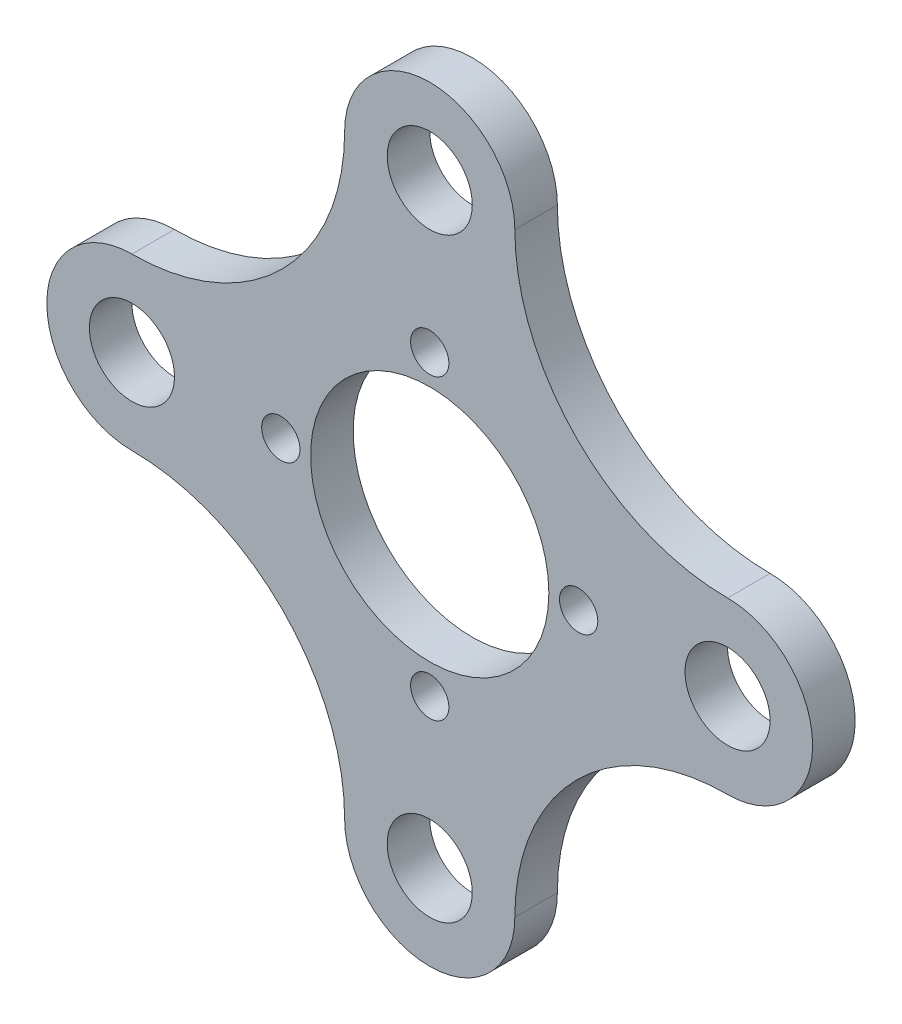
ISO-10303-21;
HEADER;
FILE_DESCRIPTION(('STEP AP214'),'2;1');
FILE_NAME('part.step','',(''),(''),'','','');
FILE_SCHEMA(('AUTOMOTIVE_DESIGN { 1 0 10303 214 1 1 1 1 }'));
ENDSEC;
DATA;
#1=APPLICATION_CONTEXT('core data for automotive mechanical design processes');
#2=APPLICATION_PROTOCOL_DEFINITION('international standard','automotive_design',2000,#1);
#3=PRODUCT_CONTEXT('',#1,'mechanical');
#4=PRODUCT('Part','Part','',(#3));
#5=PRODUCT_RELATED_PRODUCT_CATEGORY('part','',(#4));
#6=PRODUCT_DEFINITION_FORMATION('','',#4);
#7=PRODUCT_DEFINITION_CONTEXT('part definition',#1,'design');
#8=PRODUCT_DEFINITION('design','',#6,#7);
#9=PRODUCT_DEFINITION_SHAPE('','',#8);
#10=(LENGTH_UNIT() NAMED_UNIT(*) SI_UNIT(.MILLI.,.METRE.));
#11=(NAMED_UNIT(*) PLANE_ANGLE_UNIT() SI_UNIT($,.RADIAN.));
#12=(NAMED_UNIT(*) SI_UNIT($,.STERADIAN.) SOLID_ANGLE_UNIT());
#13=UNCERTAINTY_MEASURE_WITH_UNIT(LENGTH_MEASURE(1.E-05),#10,'distance_accuracy_value','');
#14=(GEOMETRIC_REPRESENTATION_CONTEXT(3) GLOBAL_UNCERTAINTY_ASSIGNED_CONTEXT((#13)) GLOBAL_UNIT_ASSIGNED_CONTEXT((#10,
#11,#12)) REPRESENTATION_CONTEXT('',''));
#15=CARTESIAN_POINT('',(0.,0.,0.));
#16=DIRECTION('',(0.,0.,1.));
#17=DIRECTION('',(1.,0.,0.));
#18=AXIS2_PLACEMENT_3D('',#15,#16,#17);
#19=CARTESIAN_POINT('',(0.,0.,5.));
#20=DIRECTION('',(0.,0.,-1.));
#21=DIRECTION('',(-1.,0.,0.));
#22=AXIS2_PLACEMENT_3D('',#19,#20,#21);
#23=CYLINDRICAL_SURFACE('',#22,14.);
#24=CARTESIAN_POINT('',(0.,0.,5.));
#25=DIRECTION('',(0.,0.,1.));
#26=DIRECTION('',(1.,0.,0.));
#27=AXIS2_PLACEMENT_3D('',#24,#25,#26);
#28=CIRCLE('',#27,14.);
#29=CARTESIAN_POINT('',(14.,0.,5.));
#30=VERTEX_POINT('',#29);
#31=EDGE_CURVE('E12',#30,#30,#28,.T.);
#32=ORIENTED_EDGE('',*,*,#31,.T.);
#33=EDGE_LOOP('',(#32));
#34=FACE_BOUND('',#33,.T.);
#35=CARTESIAN_POINT('',(0.,0.,0.));
#36=DIRECTION('',(0.,0.,1.));
#37=DIRECTION('',(1.,0.,0.));
#38=AXIS2_PLACEMENT_3D('',#35,#36,#37);
#39=CIRCLE('',#38,14.);
#40=CARTESIAN_POINT('',(14.,0.,0.));
#41=VERTEX_POINT('',#40);
#42=EDGE_CURVE('E107',#41,#41,#39,.T.);
#43=ORIENTED_EDGE('',*,*,#42,.F.);
#44=EDGE_LOOP('',(#43));
#45=FACE_BOUND('',#44,.T.);
#46=ADVANCED_FACE('F103',(#34,#45),#23,.F.);
#47=CARTESIAN_POINT('',(17.5,0.,5.));
#48=DIRECTION('',(0.,0.,-1.));
#49=DIRECTION('',(-1.,0.,0.));
#50=AXIS2_PLACEMENT_3D('',#47,#48,#49);
#51=CYLINDRICAL_SURFACE('',#50,2.25);
#52=CARTESIAN_POINT('',(17.5,0.,5.));
#53=DIRECTION('',(0.,0.,1.));
#54=DIRECTION('',(1.,0.,0.));
#55=AXIS2_PLACEMENT_3D('',#52,#53,#54);
#56=CIRCLE('',#55,2.25);
#57=CARTESIAN_POINT('',(19.75,0.,5.));
#58=VERTEX_POINT('',#57);
#59=EDGE_CURVE('E113',#58,#58,#56,.T.);
#60=ORIENTED_EDGE('',*,*,#59,.T.);
#61=EDGE_LOOP('',(#60));
#62=FACE_BOUND('',#61,.T.);
#63=CARTESIAN_POINT('',(17.5,0.,0.));
#64=DIRECTION('',(0.,0.,1.));
#65=DIRECTION('',(1.,0.,0.));
#66=AXIS2_PLACEMENT_3D('',#63,#64,#65);
#67=CIRCLE('',#66,2.25);
#68=CARTESIAN_POINT('',(19.75,0.,0.));
#69=VERTEX_POINT('',#68);
#70=EDGE_CURVE('E281',#69,#69,#67,.T.);
#71=ORIENTED_EDGE('',*,*,#70,.F.);
#72=EDGE_LOOP('',(#71));
#73=FACE_BOUND('',#72,.T.);
#74=ADVANCED_FACE('F290',(#62,#73),#51,.F.);
#75=CARTESIAN_POINT('',(0.,-17.5,5.));
#76=DIRECTION('',(0.,0.,-1.));
#77=DIRECTION('',(-1.,0.,0.));
#78=AXIS2_PLACEMENT_3D('',#75,#76,#77);
#79=CYLINDRICAL_SURFACE('',#78,2.25);
#80=CARTESIAN_POINT('',(0.,-17.5,5.));
#81=DIRECTION('',(0.,0.,1.));
#82=DIRECTION('',(1.,0.,0.));
#83=AXIS2_PLACEMENT_3D('',#80,#81,#82);
#84=CIRCLE('',#83,2.25);
#85=CARTESIAN_POINT('',(2.25,-17.5,5.));
#86=VERTEX_POINT('',#85);
#87=EDGE_CURVE('E269',#86,#86,#84,.T.);
#88=ORIENTED_EDGE('',*,*,#87,.T.);
#89=EDGE_LOOP('',(#88));
#90=FACE_BOUND('',#89,.T.);
#91=CARTESIAN_POINT('',(0.,-17.5,0.));
#92=DIRECTION('',(0.,0.,1.));
#93=DIRECTION('',(1.,0.,0.));
#94=AXIS2_PLACEMENT_3D('',#91,#92,#93);
#95=CIRCLE('',#94,2.25);
#96=CARTESIAN_POINT('',(2.25,-17.5,0.));
#97=VERTEX_POINT('',#96);
#98=EDGE_CURVE('E279',#97,#97,#95,.T.);
#99=ORIENTED_EDGE('',*,*,#98,.F.);
#100=EDGE_LOOP('',(#99));
#101=FACE_BOUND('',#100,.T.);
#102=ADVANCED_FACE('F296',(#90,#101),#79,.F.);
#103=CARTESIAN_POINT('',(-17.5,0.,5.));
#104=DIRECTION('',(0.,0.,-1.));
#105=DIRECTION('',(-1.,0.,0.));
#106=AXIS2_PLACEMENT_3D('',#103,#104,#105);
#107=CYLINDRICAL_SURFACE('',#106,2.25);
#108=CARTESIAN_POINT('',(-17.5,0.,5.));
#109=DIRECTION('',(0.,0.,1.));
#110=DIRECTION('',(1.,0.,0.));
#111=AXIS2_PLACEMENT_3D('',#108,#109,#110);
#112=CIRCLE('',#111,2.25);
#113=CARTESIAN_POINT('',(-15.25,0.,5.));
#114=VERTEX_POINT('',#113);
#115=EDGE_CURVE('E266',#114,#114,#112,.T.);
#116=ORIENTED_EDGE('',*,*,#115,.T.);
#117=EDGE_LOOP('',(#116));
#118=FACE_BOUND('',#117,.T.);
#119=CARTESIAN_POINT('',(-17.5,0.,0.));
#120=DIRECTION('',(0.,0.,1.));
#121=DIRECTION('',(1.,0.,0.));
#122=AXIS2_PLACEMENT_3D('',#119,#120,#121);
#123=CIRCLE('',#122,2.25);
#124=CARTESIAN_POINT('',(-15.25,0.,0.));
#125=VERTEX_POINT('',#124);
#126=EDGE_CURVE('E276',#125,#125,#123,.T.);
#127=ORIENTED_EDGE('',*,*,#126,.F.);
#128=EDGE_LOOP('',(#127));
#129=FACE_BOUND('',#128,.T.);
#130=ADVANCED_FACE('F303',(#118,#129),#107,.F.);
#131=CARTESIAN_POINT('',(0.,17.5,5.));
#132=DIRECTION('',(0.,0.,-1.));
#133=DIRECTION('',(-1.,0.,0.));
#134=AXIS2_PLACEMENT_3D('',#131,#132,#133);
#135=CYLINDRICAL_SURFACE('',#134,2.25);
#136=CARTESIAN_POINT('',(0.,17.5,5.));
#137=DIRECTION('',(0.,0.,1.));
#138=DIRECTION('',(1.,0.,0.));
#139=AXIS2_PLACEMENT_3D('',#136,#137,#138);
#140=CIRCLE('',#139,2.25);
#141=CARTESIAN_POINT('',(2.25,17.5,5.));
#142=VERTEX_POINT('',#141);
#143=EDGE_CURVE('E263',#142,#142,#140,.T.);
#144=ORIENTED_EDGE('',*,*,#143,.T.);
#145=EDGE_LOOP('',(#144));
#146=FACE_BOUND('',#145,.T.);
#147=CARTESIAN_POINT('',(0.,17.5,0.));
#148=DIRECTION('',(0.,0.,1.));
#149=DIRECTION('',(1.,0.,0.));
#150=AXIS2_PLACEMENT_3D('',#147,#148,#149);
#151=CIRCLE('',#150,2.25);
#152=CARTESIAN_POINT('',(2.25,17.5,0.));
#153=VERTEX_POINT('',#152);
#154=EDGE_CURVE('E253',#153,#153,#151,.T.);
#155=ORIENTED_EDGE('',*,*,#154,.F.);
#156=EDGE_LOOP('',(#155));
#157=FACE_BOUND('',#156,.T.);
#158=ADVANCED_FACE('F105',(#146,#157),#135,.F.);
#159=CARTESIAN_POINT('',(0.,0.,5.));
#160=DIRECTION('',(0.,0.,1.));
#161=DIRECTION('',(1.,0.,0.));
#162=AXIS2_PLACEMENT_3D('',#159,#160,#161);
#163=PLANE('',#162);
#164=ORIENTED_EDGE('',*,*,#143,.F.);
#165=EDGE_LOOP('',(#164));
#166=FACE_BOUND('',#165,.T.);
#167=ORIENTED_EDGE('',*,*,#115,.F.);
#168=EDGE_LOOP('',(#167));
#169=FACE_BOUND('',#168,.T.);
#170=ORIENTED_EDGE('',*,*,#87,.F.);
#171=EDGE_LOOP('',(#170));
#172=FACE_BOUND('',#171,.T.);
#173=ORIENTED_EDGE('',*,*,#59,.F.);
#174=EDGE_LOOP('',(#173));
#175=FACE_BOUND('',#174,.T.);
#176=ORIENTED_EDGE('',*,*,#31,.F.);
#177=EDGE_LOOP('',(#176));
#178=FACE_BOUND('',#177,.T.);
#179=CARTESIAN_POINT('',(-34.9999999999999,35.,5.));
#180=DIRECTION('',(0.,0.,1.));
#181=DIRECTION('',(1.,0.,0.));
#182=AXIS2_PLACEMENT_3D('',#179,#180,#181);
#183=CIRCLE('',#182,24.9999999999999);
#184=CARTESIAN_POINT('',(-9.99999999999996,35.,5.));
#185=VERTEX_POINT('',#184);
#186=CARTESIAN_POINT('',(-35.,10.0000000000001,5.));
#187=VERTEX_POINT('',#186);
#188=EDGE_CURVE('E224',#185,#187,#183,.F.);
#189=ORIENTED_EDGE('',*,*,#188,.T.);
#190=CARTESIAN_POINT('',(-35.,1.47198317172268E-13,5.));
#191=DIRECTION('',(0.,0.,1.));
#192=DIRECTION('',(1.,0.,0.));
#193=AXIS2_PLACEMENT_3D('',#190,#191,#192);
#194=CIRCLE('',#193,10.);
#195=CARTESIAN_POINT('',(-35.,-9.99999999999981,5.));
#196=VERTEX_POINT('',#195);
#197=EDGE_CURVE('E227',#187,#196,#194,.T.);
#198=ORIENTED_EDGE('',*,*,#197,.T.);
#199=CARTESIAN_POINT('',(-35.,-34.9999999999998,5.));
#200=DIRECTION('',(0.,0.,1.));
#201=DIRECTION('',(1.,0.,0.));
#202=AXIS2_PLACEMENT_3D('',#199,#200,#201);
#203=CIRCLE('',#202,25.);
#204=CARTESIAN_POINT('',(-10.,-35.,5.));
#205=VERTEX_POINT('',#204);
#206=EDGE_CURVE('E230',#196,#205,#203,.F.);
#207=ORIENTED_EDGE('',*,*,#206,.T.);
#208=CARTESIAN_POINT('',(0.,-35.,5.));
#209=DIRECTION('',(0.,0.,1.));
#210=DIRECTION('',(1.,0.,0.));
#211=AXIS2_PLACEMENT_3D('',#208,#209,#210);
#212=CIRCLE('',#211,10.0000000000001);
#213=CARTESIAN_POINT('',(10.,-35.,5.));
#214=VERTEX_POINT('',#213);
#215=EDGE_CURVE('E233',#205,#214,#212,.T.);
#216=ORIENTED_EDGE('',*,*,#215,.T.);
#217=CARTESIAN_POINT('',(35.0000000000001,-35.,5.));
#218=DIRECTION('',(0.,0.,1.));
#219=DIRECTION('',(1.,0.,0.));
#220=AXIS2_PLACEMENT_3D('',#217,#218,#219);
#221=CIRCLE('',#220,25.0000000000001);
#222=CARTESIAN_POINT('',(35.,-9.99999999999991,5.));
#223=VERTEX_POINT('',#222);
#224=EDGE_CURVE('E182',#214,#223,#221,.F.);
#225=ORIENTED_EDGE('',*,*,#224,.T.);
#226=CARTESIAN_POINT('',(35.,0.,5.));
#227=DIRECTION('',(0.,0.,1.));
#228=DIRECTION('',(1.,0.,0.));
#229=AXIS2_PLACEMENT_3D('',#226,#227,#228);
#230=CIRCLE('',#229,9.99999999999999);
#231=CARTESIAN_POINT('',(35.,9.99999999999995,5.));
#232=VERTEX_POINT('',#231);
#233=EDGE_CURVE('E236',#223,#232,#230,.T.);
#234=ORIENTED_EDGE('',*,*,#233,.T.);
#235=CARTESIAN_POINT('',(35.,34.9999999999999,5.));
#236=DIRECTION('',(0.,0.,1.));
#237=DIRECTION('',(1.,0.,0.));
#238=AXIS2_PLACEMENT_3D('',#235,#236,#237);
#239=CIRCLE('',#238,25.);
#240=CARTESIAN_POINT('',(9.99999999999996,35.,5.));
#241=VERTEX_POINT('',#240);
#242=EDGE_CURVE('E218',#232,#241,#239,.F.);
#243=ORIENTED_EDGE('',*,*,#242,.T.);
#244=CARTESIAN_POINT('',(0.,35.,5.));
#245=DIRECTION('',(0.,0.,1.));
#246=DIRECTION('',(1.,0.,0.));
#247=AXIS2_PLACEMENT_3D('',#244,#245,#246);
#248=CIRCLE('',#247,9.99999999999991);
#249=EDGE_CURVE('E221',#241,#185,#248,.T.);
#250=ORIENTED_EDGE('',*,*,#249,.T.);
#251=EDGE_LOOP('',(#189,#198,#207,#216,#225,#234,#243,#250));
#252=FACE_BOUND('',#251,.T.);
#253=CARTESIAN_POINT('',(0.,35.,5.));
#254=DIRECTION('',(0.,0.,1.));
#255=DIRECTION('',(1.,0.,0.));
#256=AXIS2_PLACEMENT_3D('',#253,#254,#255);
#257=CIRCLE('',#256,4.99999999999991);
#258=CARTESIAN_POINT('',(4.99999999999991,35.,5.));
#259=VERTEX_POINT('',#258);
#260=EDGE_CURVE('E239',#259,#259,#257,.T.);
#261=ORIENTED_EDGE('',*,*,#260,.F.);
#262=EDGE_LOOP('',(#261));
#263=FACE_BOUND('',#262,.T.);
#264=CARTESIAN_POINT('',(35.,0.,5.));
#265=DIRECTION('',(0.,0.,1.));
#266=DIRECTION('',(1.,0.,0.));
#267=AXIS2_PLACEMENT_3D('',#264,#265,#266);
#268=CIRCLE('',#267,5.);
#269=CARTESIAN_POINT('',(40.,0.,5.));
#270=VERTEX_POINT('',#269);
#271=EDGE_CURVE('E242',#270,#270,#268,.T.);
#272=ORIENTED_EDGE('',*,*,#271,.F.);
#273=EDGE_LOOP('',(#272));
#274=FACE_BOUND('',#273,.T.);
#275=CARTESIAN_POINT('',(0.,-35.,5.));
#276=DIRECTION('',(0.,0.,1.));
#277=DIRECTION('',(1.,0.,0.));
#278=AXIS2_PLACEMENT_3D('',#275,#276,#277);
#279=CIRCLE('',#278,5.00000000000011);
#280=CARTESIAN_POINT('',(5.00000000000019,-35.,5.));
#281=VERTEX_POINT('',#280);
#282=EDGE_CURVE('E248',#281,#281,#279,.T.);
#283=ORIENTED_EDGE('',*,*,#282,.F.);
#284=EDGE_LOOP('',(#283));
#285=FACE_BOUND('',#284,.T.);
#286=CARTESIAN_POINT('',(-35.,1.47198317172268E-13,5.));
#287=DIRECTION('',(0.,0.,1.));
#288=DIRECTION('',(1.,0.,0.));
#289=AXIS2_PLACEMENT_3D('',#286,#287,#288);
#290=CIRCLE('',#289,5.);
#291=CARTESIAN_POINT('',(-30.,1.47198317172268E-13,5.));
#292=VERTEX_POINT('',#291);
#293=EDGE_CURVE('E245',#292,#292,#290,.T.);
#294=ORIENTED_EDGE('',*,*,#293,.F.);
#295=EDGE_LOOP('',(#294));
#296=FACE_BOUND('',#295,.T.);
#297=ADVANCED_FACE('F310',(#166,#169,#172,#175,#178,#252,#263,#274,#285,#296),#163,.T.);
#298=CARTESIAN_POINT('',(0.,0.,0.));
#299=DIRECTION('',(0.,0.,1.));
#300=DIRECTION('',(1.,0.,0.));
#301=AXIS2_PLACEMENT_3D('',#298,#299,#300);
#302=PLANE('',#301);
#303=ORIENTED_EDGE('',*,*,#154,.T.);
#304=EDGE_LOOP('',(#303));
#305=FACE_BOUND('',#304,.T.);
#306=ORIENTED_EDGE('',*,*,#126,.T.);
#307=EDGE_LOOP('',(#306));
#308=FACE_BOUND('',#307,.T.);
#309=ORIENTED_EDGE('',*,*,#98,.T.);
#310=EDGE_LOOP('',(#309));
#311=FACE_BOUND('',#310,.T.);
#312=ORIENTED_EDGE('',*,*,#70,.T.);
#313=EDGE_LOOP('',(#312));
#314=FACE_BOUND('',#313,.T.);
#315=ORIENTED_EDGE('',*,*,#42,.T.);
#316=EDGE_LOOP('',(#315));
#317=FACE_BOUND('',#316,.T.);
#318=CARTESIAN_POINT('',(-35.,-34.9999999999998,0.));
#319=DIRECTION('',(0.,0.,1.));
#320=DIRECTION('',(1.,0.,0.));
#321=AXIS2_PLACEMENT_3D('',#318,#319,#320);
#322=CIRCLE('',#321,25.);
#323=CARTESIAN_POINT('',(-35.,-9.99999999999981,0.));
#324=VERTEX_POINT('',#323);
#325=CARTESIAN_POINT('',(-10.,-35.,0.));
#326=VERTEX_POINT('',#325);
#327=EDGE_CURVE('E199',#324,#326,#322,.F.);
#328=ORIENTED_EDGE('',*,*,#327,.F.);
#329=CARTESIAN_POINT('',(-35.,1.47198317172268E-13,0.));
#330=DIRECTION('',(0.,0.,1.));
#331=DIRECTION('',(1.,0.,0.));
#332=AXIS2_PLACEMENT_3D('',#329,#330,#331);
#333=CIRCLE('',#332,10.);
#334=CARTESIAN_POINT('',(-35.,10.0000000000001,0.));
#335=VERTEX_POINT('',#334);
#336=EDGE_CURVE('E201',#335,#324,#333,.T.);
#337=ORIENTED_EDGE('',*,*,#336,.F.);
#338=CARTESIAN_POINT('',(-34.9999999999999,35.,0.));
#339=DIRECTION('',(0.,0.,1.));
#340=DIRECTION('',(1.,0.,0.));
#341=AXIS2_PLACEMENT_3D('',#338,#339,#340);
#342=CIRCLE('',#341,24.9999999999999);
#343=CARTESIAN_POINT('',(-9.99999999999996,35.,0.));
#344=VERTEX_POINT('',#343);
#345=EDGE_CURVE('E677',#344,#335,#342,.F.);
#346=ORIENTED_EDGE('',*,*,#345,.F.);
#347=CARTESIAN_POINT('',(0.,35.,0.));
#348=DIRECTION('',(0.,0.,1.));
#349=DIRECTION('',(1.,0.,0.));
#350=AXIS2_PLACEMENT_3D('',#347,#348,#349);
#351=CIRCLE('',#350,9.99999999999991);
#352=CARTESIAN_POINT('',(9.99999999999996,35.,0.));
#353=VERTEX_POINT('',#352);
#354=EDGE_CURVE('E678',#353,#344,#351,.T.);
#355=ORIENTED_EDGE('',*,*,#354,.F.);
#356=CARTESIAN_POINT('',(35.,34.9999999999999,0.));
#357=DIRECTION('',(0.,0.,1.));
#358=DIRECTION('',(1.,0.,0.));
#359=AXIS2_PLACEMENT_3D('',#356,#357,#358);
#360=CIRCLE('',#359,25.);
#361=CARTESIAN_POINT('',(35.,9.99999999999995,0.));
#362=VERTEX_POINT('',#361);
#363=EDGE_CURVE('E251',#362,#353,#360,.F.);
#364=ORIENTED_EDGE('',*,*,#363,.F.);
#365=CARTESIAN_POINT('',(35.,0.,0.));
#366=DIRECTION('',(0.,0.,1.));
#367=DIRECTION('',(1.,0.,0.));
#368=AXIS2_PLACEMENT_3D('',#365,#366,#367);
#369=CIRCLE('',#368,9.99999999999999);
#370=CARTESIAN_POINT('',(35.,-9.99999999999991,0.));
#371=VERTEX_POINT('',#370);
#372=EDGE_CURVE('E196',#371,#362,#369,.T.);
#373=ORIENTED_EDGE('',*,*,#372,.F.);
#374=CARTESIAN_POINT('',(35.0000000000001,-35.,0.));
#375=DIRECTION('',(0.,0.,1.));
#376=DIRECTION('',(1.,0.,0.));
#377=AXIS2_PLACEMENT_3D('',#374,#375,#376);
#378=CIRCLE('',#377,25.0000000000001);
#379=CARTESIAN_POINT('',(10.,-35.,0.));
#380=VERTEX_POINT('',#379);
#381=EDGE_CURVE('E180',#380,#371,#378,.F.);
#382=ORIENTED_EDGE('',*,*,#381,.F.);
#383=CARTESIAN_POINT('',(0.,-35.,0.));
#384=DIRECTION('',(0.,0.,1.));
#385=DIRECTION('',(1.,0.,0.));
#386=AXIS2_PLACEMENT_3D('',#383,#384,#385);
#387=CIRCLE('',#386,10.0000000000001);
#388=EDGE_CURVE('E194',#326,#380,#387,.T.);
#389=ORIENTED_EDGE('',*,*,#388,.F.);
#390=EDGE_LOOP('',(#328,#337,#346,#355,#364,#373,#382,#389));
#391=FACE_BOUND('',#390,.T.);
#392=CARTESIAN_POINT('',(0.,35.,0.));
#393=DIRECTION('',(0.,0.,1.));
#394=DIRECTION('',(1.,0.,0.));
#395=AXIS2_PLACEMENT_3D('',#392,#393,#394);
#396=CIRCLE('',#395,4.99999999999991);
#397=CARTESIAN_POINT('',(4.99999999999991,35.,0.));
#398=VERTEX_POINT('',#397);
#399=EDGE_CURVE('E206',#398,#398,#396,.T.);
#400=ORIENTED_EDGE('',*,*,#399,.T.);
#401=EDGE_LOOP('',(#400));
#402=FACE_BOUND('',#401,.T.);
#403=CARTESIAN_POINT('',(35.,0.,0.));
#404=DIRECTION('',(0.,0.,1.));
#405=DIRECTION('',(1.,0.,0.));
#406=AXIS2_PLACEMENT_3D('',#403,#404,#405);
#407=CIRCLE('',#406,5.);
#408=CARTESIAN_POINT('',(40.,0.,0.));
#409=VERTEX_POINT('',#408);
#410=EDGE_CURVE('E209',#409,#409,#407,.T.);
#411=ORIENTED_EDGE('',*,*,#410,.T.);
#412=EDGE_LOOP('',(#411));
#413=FACE_BOUND('',#412,.T.);
#414=CARTESIAN_POINT('',(0.,-35.,0.));
#415=DIRECTION('',(0.,0.,1.));
#416=DIRECTION('',(1.,0.,0.));
#417=AXIS2_PLACEMENT_3D('',#414,#415,#416);
#418=CIRCLE('',#417,5.00000000000011);
#419=CARTESIAN_POINT('',(5.00000000000019,-35.,0.));
#420=VERTEX_POINT('',#419);
#421=EDGE_CURVE('E215',#420,#420,#418,.T.);
#422=ORIENTED_EDGE('',*,*,#421,.T.);
#423=EDGE_LOOP('',(#422));
#424=FACE_BOUND('',#423,.T.);
#425=CARTESIAN_POINT('',(-35.,1.47198317172268E-13,0.));
#426=DIRECTION('',(0.,0.,1.));
#427=DIRECTION('',(1.,0.,0.));
#428=AXIS2_PLACEMENT_3D('',#425,#426,#427);
#429=CIRCLE('',#428,5.);
#430=CARTESIAN_POINT('',(-30.,1.47198317172268E-13,0.));
#431=VERTEX_POINT('',#430);
#432=EDGE_CURVE('E212',#431,#431,#429,.T.);
#433=ORIENTED_EDGE('',*,*,#432,.T.);
#434=EDGE_LOOP('',(#433));
#435=FACE_BOUND('',#434,.T.);
#436=ADVANCED_FACE('F192',(#305,#308,#311,#314,#317,#391,#402,#413,#424,#435),#302,.F.);
#437=CARTESIAN_POINT('',(-35.,1.47198317172268E-13,0.));
#438=DIRECTION('',(0.,0.,1.));
#439=DIRECTION('',(1.,0.,0.));
#440=AXIS2_PLACEMENT_3D('',#437,#438,#439);
#441=CYLINDRICAL_SURFACE('',#440,5.);
#442=ORIENTED_EDGE('',*,*,#432,.F.);
#443=EDGE_LOOP('',(#442));
#444=FACE_BOUND('',#443,.T.);
#445=ORIENTED_EDGE('',*,*,#293,.T.);
#446=EDGE_LOOP('',(#445));
#447=FACE_BOUND('',#446,.T.);
#448=ADVANCED_FACE('F318',(#444,#447),#441,.F.);
#449=CARTESIAN_POINT('',(-35.,1.47198317172268E-13,0.));
#450=DIRECTION('',(0.,0.,1.));
#451=DIRECTION('',(1.,0.,0.));
#452=AXIS2_PLACEMENT_3D('',#449,#450,#451);
#453=CYLINDRICAL_SURFACE('',#452,10.);
#454=ORIENTED_EDGE('',*,*,#197,.F.);
#455=DIRECTION('',(0.,0.,1.));
#456=VECTOR('',#455,1.);
#457=CARTESIAN_POINT('',(-35.,10.0000000000001,0.));
#458=LINE('',#457,#456);
#459=EDGE_CURVE('E258',#335,#187,#458,.T.);
#460=ORIENTED_EDGE('',*,*,#459,.F.);
#461=ORIENTED_EDGE('',*,*,#336,.T.);
#462=DIRECTION('',(0.,0.,1.));
#463=VECTOR('',#462,1.);
#464=CARTESIAN_POINT('',(-35.,-9.99999999999981,0.));
#465=LINE('',#464,#463);
#466=EDGE_CURVE('E256',#324,#196,#465,.T.);
#467=ORIENTED_EDGE('',*,*,#466,.T.);
#468=EDGE_LOOP('',(#454,#460,#461,#467));
#469=FACE_BOUND('',#468,.T.);
#470=ADVANCED_FACE('F326',(#469),#453,.T.);
#471=CARTESIAN_POINT('',(0.,-35.,0.));
#472=DIRECTION('',(0.,0.,1.));
#473=DIRECTION('',(1.,0.,0.));
#474=AXIS2_PLACEMENT_3D('',#471,#472,#473);
#475=CYLINDRICAL_SURFACE('',#474,5.00000000000011);
#476=ORIENTED_EDGE('',*,*,#421,.F.);
#477=EDGE_LOOP('',(#476));
#478=FACE_BOUND('',#477,.T.);
#479=ORIENTED_EDGE('',*,*,#282,.T.);
#480=EDGE_LOOP('',(#479));
#481=FACE_BOUND('',#480,.T.);
#482=ADVANCED_FACE('F329',(#478,#481),#475,.F.);
#483=CARTESIAN_POINT('',(35.,0.,0.));
#484=DIRECTION('',(0.,0.,1.));
#485=DIRECTION('',(1.,0.,0.));
#486=AXIS2_PLACEMENT_3D('',#483,#484,#485);
#487=CYLINDRICAL_SURFACE('',#486,5.);
#488=ORIENTED_EDGE('',*,*,#410,.F.);
#489=EDGE_LOOP('',(#488));
#490=FACE_BOUND('',#489,.T.);
#491=ORIENTED_EDGE('',*,*,#271,.T.);
#492=EDGE_LOOP('',(#491));
#493=FACE_BOUND('',#492,.T.);
#494=ADVANCED_FACE('F365',(#490,#493),#487,.F.);
#495=CARTESIAN_POINT('',(0.,35.,0.));
#496=DIRECTION('',(0.,0.,1.));
#497=DIRECTION('',(1.,0.,0.));
#498=AXIS2_PLACEMENT_3D('',#495,#496,#497);
#499=CYLINDRICAL_SURFACE('',#498,4.99999999999991);
#500=ORIENTED_EDGE('',*,*,#399,.F.);
#501=EDGE_LOOP('',(#500));
#502=FACE_BOUND('',#501,.T.);
#503=ORIENTED_EDGE('',*,*,#260,.T.);
#504=EDGE_LOOP('',(#503));
#505=FACE_BOUND('',#504,.T.);
#506=ADVANCED_FACE('F348',(#502,#505),#499,.F.);
#507=CARTESIAN_POINT('',(-34.9999999999999,35.,0.));
#508=DIRECTION('',(0.,0.,1.));
#509=DIRECTION('',(1.,0.,0.));
#510=AXIS2_PLACEMENT_3D('',#507,#508,#509);
#511=CYLINDRICAL_SURFACE('',#510,24.9999999999999);
#512=ORIENTED_EDGE('',*,*,#188,.F.);
#513=DIRECTION('',(0.,0.,1.));
#514=VECTOR('',#513,1.);
#515=CARTESIAN_POINT('',(-9.99999999999996,35.,0.));
#516=LINE('',#515,#514);
#517=EDGE_CURVE('E260',#344,#185,#516,.T.);
#518=ORIENTED_EDGE('',*,*,#517,.F.);
#519=ORIENTED_EDGE('',*,*,#345,.T.);
#520=ORIENTED_EDGE('',*,*,#459,.T.);
#521=EDGE_LOOP('',(#512,#518,#519,#520));
#522=FACE_BOUND('',#521,.T.);
#523=ADVANCED_FACE('F345',(#522),#511,.F.);
#524=CARTESIAN_POINT('',(0.,35.,0.));
#525=DIRECTION('',(0.,0.,1.));
#526=DIRECTION('',(1.,0.,0.));
#527=AXIS2_PLACEMENT_3D('',#524,#525,#526);
#528=CYLINDRICAL_SURFACE('',#527,9.99999999999991);
#529=ORIENTED_EDGE('',*,*,#249,.F.);
#530=DIRECTION('',(0.,0.,1.));
#531=VECTOR('',#530,1.);
#532=CARTESIAN_POINT('',(9.99999999999996,35.,0.));
#533=LINE('',#532,#531);
#534=EDGE_CURVE('E163',#353,#241,#533,.T.);
#535=ORIENTED_EDGE('',*,*,#534,.F.);
#536=ORIENTED_EDGE('',*,*,#354,.T.);
#537=ORIENTED_EDGE('',*,*,#517,.T.);
#538=EDGE_LOOP('',(#529,#535,#536,#537));
#539=FACE_BOUND('',#538,.T.);
#540=ADVANCED_FACE('F342',(#539),#528,.T.);
#541=CARTESIAN_POINT('',(35.,34.9999999999999,0.));
#542=DIRECTION('',(0.,0.,1.));
#543=DIRECTION('',(1.,0.,0.));
#544=AXIS2_PLACEMENT_3D('',#541,#542,#543);
#545=CYLINDRICAL_SURFACE('',#544,25.);
#546=ORIENTED_EDGE('',*,*,#242,.F.);
#547=DIRECTION('',(0.,0.,1.));
#548=VECTOR('',#547,1.);
#549=CARTESIAN_POINT('',(35.,9.99999999999995,0.));
#550=LINE('',#549,#548);
#551=EDGE_CURVE('E122',#362,#232,#550,.T.);
#552=ORIENTED_EDGE('',*,*,#551,.F.);
#553=ORIENTED_EDGE('',*,*,#363,.T.);
#554=ORIENTED_EDGE('',*,*,#534,.T.);
#555=EDGE_LOOP('',(#546,#552,#553,#554));
#556=FACE_BOUND('',#555,.T.);
#557=ADVANCED_FACE('F338',(#556),#545,.F.);
#558=CARTESIAN_POINT('',(35.,0.,0.));
#559=DIRECTION('',(0.,0.,1.));
#560=DIRECTION('',(1.,0.,0.));
#561=AXIS2_PLACEMENT_3D('',#558,#559,#560);
#562=CYLINDRICAL_SURFACE('',#561,9.99999999999999);
#563=ORIENTED_EDGE('',*,*,#233,.F.);
#564=DIRECTION('',(0.,0.,1.));
#565=VECTOR('',#564,1.);
#566=CARTESIAN_POINT('',(35.,-9.99999999999991,0.));
#567=LINE('',#566,#565);
#568=EDGE_CURVE('E151',#371,#223,#567,.T.);
#569=ORIENTED_EDGE('',*,*,#568,.F.);
#570=ORIENTED_EDGE('',*,*,#372,.T.);
#571=ORIENTED_EDGE('',*,*,#551,.T.);
#572=EDGE_LOOP('',(#563,#569,#570,#571));
#573=FACE_BOUND('',#572,.T.);
#574=ADVANCED_FACE('F341',(#573),#562,.T.);
#575=CARTESIAN_POINT('',(35.0000000000001,-35.,0.));
#576=DIRECTION('',(0.,0.,1.));
#577=DIRECTION('',(1.,0.,0.));
#578=AXIS2_PLACEMENT_3D('',#575,#576,#577);
#579=CYLINDRICAL_SURFACE('',#578,25.0000000000001);
#580=ORIENTED_EDGE('',*,*,#224,.F.);
#581=DIRECTION('',(0.,0.,1.));
#582=VECTOR('',#581,1.);
#583=CARTESIAN_POINT('',(10.,-35.,0.));
#584=LINE('',#583,#582);
#585=EDGE_CURVE('E177',#380,#214,#584,.T.);
#586=ORIENTED_EDGE('',*,*,#585,.F.);
#587=ORIENTED_EDGE('',*,*,#381,.T.);
#588=ORIENTED_EDGE('',*,*,#568,.T.);
#589=EDGE_LOOP('',(#580,#586,#587,#588));
#590=FACE_BOUND('',#589,.T.);
#591=ADVANCED_FACE('F179',(#590),#579,.F.);
#592=CARTESIAN_POINT('',(0.,-35.,0.));
#593=DIRECTION('',(0.,0.,1.));
#594=DIRECTION('',(1.,0.,0.));
#595=AXIS2_PLACEMENT_3D('',#592,#593,#594);
#596=CYLINDRICAL_SURFACE('',#595,10.0000000000001);
#597=ORIENTED_EDGE('',*,*,#215,.F.);
#598=DIRECTION('',(0.,0.,1.));
#599=VECTOR('',#598,1.);
#600=CARTESIAN_POINT('',(-10.,-35.,0.));
#601=LINE('',#600,#599);
#602=EDGE_CURVE('E187',#326,#205,#601,.T.);
#603=ORIENTED_EDGE('',*,*,#602,.F.);
#604=ORIENTED_EDGE('',*,*,#388,.T.);
#605=ORIENTED_EDGE('',*,*,#585,.T.);
#606=EDGE_LOOP('',(#597,#603,#604,#605));
#607=FACE_BOUND('',#606,.T.);
#608=ADVANCED_FACE('F198',(#607),#596,.T.);
#609=CARTESIAN_POINT('',(-35.,-34.9999999999998,0.));
#610=DIRECTION('',(0.,0.,1.));
#611=DIRECTION('',(1.,0.,0.));
#612=AXIS2_PLACEMENT_3D('',#609,#610,#611);
#613=CYLINDRICAL_SURFACE('',#612,25.);
#614=ORIENTED_EDGE('',*,*,#206,.F.);
#615=ORIENTED_EDGE('',*,*,#466,.F.);
#616=ORIENTED_EDGE('',*,*,#327,.T.);
#617=ORIENTED_EDGE('',*,*,#602,.T.);
#618=EDGE_LOOP('',(#614,#615,#616,#617));
#619=FACE_BOUND('',#618,.T.);
#620=ADVANCED_FACE('F353',(#619),#613,.F.);
#621=CLOSED_SHELL('',(#46,#74,#102,#130,#158,#297,#436,#448,#470,#482,#494,#506,#523,#540,#557,
#574,#591,#608,#620));
#622=MANIFOLD_SOLID_BREP('B2',#621);
#623=ADVANCED_BREP_SHAPE_REPRESENTATION('',(#18,#622),#14);
#624=SHAPE_DEFINITION_REPRESENTATION(#9,#623);
ENDSEC;
END-ISO-10303-21;
